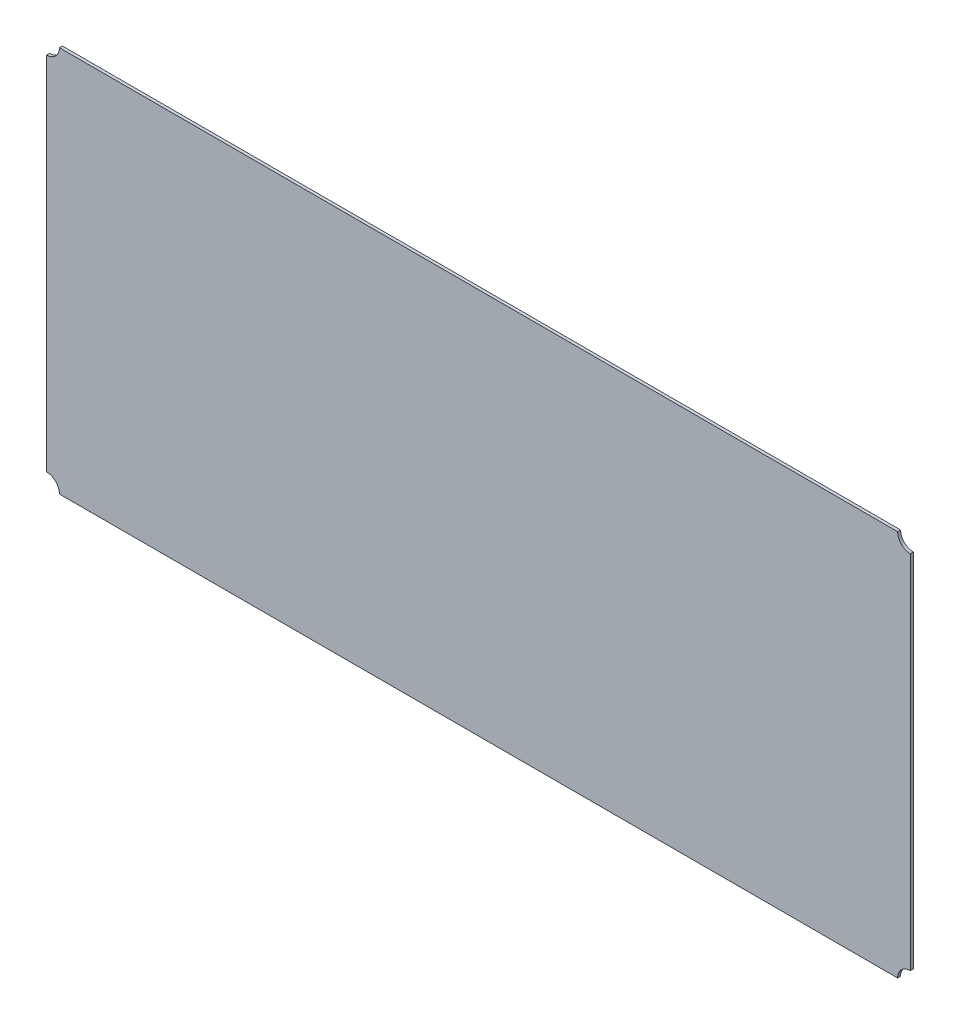
ISO-10303-21;
HEADER;
FILE_DESCRIPTION(('STEP AP214'),'2;1');
FILE_NAME('part.step','',(''),(''),'','','');
FILE_SCHEMA(('AUTOMOTIVE_DESIGN { 1 0 10303 214 1 1 1 1 }'));
ENDSEC;
DATA;
#1=APPLICATION_CONTEXT('core data for automotive mechanical design processes');
#2=APPLICATION_PROTOCOL_DEFINITION('international standard','automotive_design',2000,#1);
#3=PRODUCT_CONTEXT('',#1,'mechanical');
#4=PRODUCT('Part','Part','',(#3));
#5=PRODUCT_RELATED_PRODUCT_CATEGORY('part','',(#4));
#6=PRODUCT_DEFINITION_FORMATION('','',#4);
#7=PRODUCT_DEFINITION_CONTEXT('part definition',#1,'design');
#8=PRODUCT_DEFINITION('design','',#6,#7);
#9=PRODUCT_DEFINITION_SHAPE('','',#8);
#10=(LENGTH_UNIT() NAMED_UNIT(*) SI_UNIT(.MILLI.,.METRE.));
#11=(NAMED_UNIT(*) PLANE_ANGLE_UNIT() SI_UNIT($,.RADIAN.));
#12=(NAMED_UNIT(*) SI_UNIT($,.STERADIAN.) SOLID_ANGLE_UNIT());
#13=UNCERTAINTY_MEASURE_WITH_UNIT(LENGTH_MEASURE(1.E-05),#10,'distance_accuracy_value','');
#14=(GEOMETRIC_REPRESENTATION_CONTEXT(3) GLOBAL_UNCERTAINTY_ASSIGNED_CONTEXT((#13)) GLOBAL_UNIT_ASSIGNED_CONTEXT((#10,
#11,#12)) REPRESENTATION_CONTEXT('',''));
#15=CARTESIAN_POINT('',(0.,0.,0.));
#16=DIRECTION('',(0.,0.,1.));
#17=DIRECTION('',(1.,0.,0.));
#18=AXIS2_PLACEMENT_3D('',#15,#16,#17);
#19=CARTESIAN_POINT('',(-441.25,-197.5,-3.));
#20=DIRECTION('',(-1.,0.,0.));
#21=DIRECTION('',(0.,0.,1.));
#22=AXIS2_PLACEMENT_3D('',#19,#20,#21);
#23=PLANE('',#22);
#24=DIRECTION('',(0.,0.,1.));
#25=VECTOR('',#24,1.);
#26=CARTESIAN_POINT('',(-441.25,-184.5,-3.));
#27=LINE('',#26,#25);
#28=CARTESIAN_POINT('',(-441.25,-184.5,0.));
#29=VERTEX_POINT('',#28);
#30=CARTESIAN_POINT('',(-441.25,-184.5,-3.));
#31=VERTEX_POINT('',#30);
#32=EDGE_CURVE('E131',#29,#31,#27,.F.);
#33=ORIENTED_EDGE('',*,*,#32,.F.);
#34=DIRECTION('',(0.,-1.,0.));
#35=VECTOR('',#34,1.);
#36=CARTESIAN_POINT('',(-441.25,-197.5,0.));
#37=LINE('',#36,#35);
#38=CARTESIAN_POINT('',(-441.25,184.5,0.));
#39=VERTEX_POINT('',#38);
#40=EDGE_CURVE('E127',#39,#29,#37,.T.);
#41=ORIENTED_EDGE('',*,*,#40,.F.);
#42=DIRECTION('',(0.,0.,1.));
#43=VECTOR('',#42,1.);
#44=CARTESIAN_POINT('',(-441.25,184.5,-3.));
#45=LINE('',#44,#43);
#46=CARTESIAN_POINT('',(-441.25,184.5,-3.));
#47=VERTEX_POINT('',#46);
#48=EDGE_CURVE('E147',#47,#39,#45,.T.);
#49=ORIENTED_EDGE('',*,*,#48,.F.);
#50=DIRECTION('',(0.,-1.,0.));
#51=VECTOR('',#50,1.);
#52=CARTESIAN_POINT('',(-441.25,-197.5,-3.));
#53=LINE('',#52,#51);
#54=EDGE_CURVE('E123',#47,#31,#53,.T.);
#55=ORIENTED_EDGE('',*,*,#54,.T.);
#56=EDGE_LOOP('',(#33,#41,#49,#55));
#57=FACE_BOUND('',#56,.T.);
#58=ADVANCED_FACE('F33',(#57),#23,.T.);
#59=CARTESIAN_POINT('',(441.25,197.5,-3.));
#60=DIRECTION('',(0.,1.,0.));
#61=DIRECTION('',(0.,0.,1.));
#62=AXIS2_PLACEMENT_3D('',#59,#60,#61);
#63=PLANE('',#62);
#64=DIRECTION('',(0.,0.,1.));
#65=VECTOR('',#64,1.);
#66=CARTESIAN_POINT('',(-428.25,197.5,-3.));
#67=LINE('',#66,#65);
#68=CARTESIAN_POINT('',(-428.25,197.5,0.));
#69=VERTEX_POINT('',#68);
#70=CARTESIAN_POINT('',(-428.25,197.5,-3.));
#71=VERTEX_POINT('',#70);
#72=EDGE_CURVE('E144',#69,#71,#67,.F.);
#73=ORIENTED_EDGE('',*,*,#72,.F.);
#74=DIRECTION('',(-1.,0.,0.));
#75=VECTOR('',#74,1.);
#76=CARTESIAN_POINT('',(441.25,197.5,0.));
#77=LINE('',#76,#75);
#78=CARTESIAN_POINT('',(428.25,197.5,0.));
#79=VERTEX_POINT('',#78);
#80=EDGE_CURVE('E135',#79,#69,#77,.T.);
#81=ORIENTED_EDGE('',*,*,#80,.F.);
#82=DIRECTION('',(0.,0.,1.));
#83=VECTOR('',#82,1.);
#84=CARTESIAN_POINT('',(428.25,197.5,-3.));
#85=LINE('',#84,#83);
#86=CARTESIAN_POINT('',(428.25,197.5,-3.));
#87=VERTEX_POINT('',#86);
#88=EDGE_CURVE('E47',#87,#79,#85,.T.);
#89=ORIENTED_EDGE('',*,*,#88,.F.);
#90=DIRECTION('',(-1.,0.,0.));
#91=VECTOR('',#90,1.);
#92=CARTESIAN_POINT('',(441.25,197.5,-3.));
#93=LINE('',#92,#91);
#94=EDGE_CURVE('E117',#87,#71,#93,.T.);
#95=ORIENTED_EDGE('',*,*,#94,.T.);
#96=EDGE_LOOP('',(#73,#81,#89,#95));
#97=FACE_BOUND('',#96,.T.);
#98=ADVANCED_FACE('F152',(#97),#63,.T.);
#99=CARTESIAN_POINT('',(441.25,-197.5,-3.));
#100=DIRECTION('',(1.,0.,0.));
#101=DIRECTION('',(0.,0.,-1.));
#102=AXIS2_PLACEMENT_3D('',#99,#100,#101);
#103=PLANE('',#102);
#104=DIRECTION('',(0.,0.,1.));
#105=VECTOR('',#104,1.);
#106=CARTESIAN_POINT('',(441.25,184.5,-3.));
#107=LINE('',#106,#105);
#108=CARTESIAN_POINT('',(441.25,184.5,0.));
#109=VERTEX_POINT('',#108);
#110=CARTESIAN_POINT('',(441.25,184.5,-3.));
#111=VERTEX_POINT('',#110);
#112=EDGE_CURVE('E112',#109,#111,#107,.F.);
#113=ORIENTED_EDGE('',*,*,#112,.F.);
#114=DIRECTION('',(0.,1.,0.));
#115=VECTOR('',#114,1.);
#116=CARTESIAN_POINT('',(441.25,-197.5,0.));
#117=LINE('',#116,#115);
#118=CARTESIAN_POINT('',(441.25,-184.5,0.));
#119=VERTEX_POINT('',#118);
#120=EDGE_CURVE('E111',#119,#109,#117,.T.);
#121=ORIENTED_EDGE('',*,*,#120,.F.);
#122=DIRECTION('',(0.,0.,1.));
#123=VECTOR('',#122,1.);
#124=CARTESIAN_POINT('',(441.25,-184.5,-3.));
#125=LINE('',#124,#123);
#126=CARTESIAN_POINT('',(441.25,-184.5,-3.));
#127=VERTEX_POINT('',#126);
#128=EDGE_CURVE('E55',#127,#119,#125,.T.);
#129=ORIENTED_EDGE('',*,*,#128,.F.);
#130=DIRECTION('',(0.,1.,0.));
#131=VECTOR('',#130,1.);
#132=CARTESIAN_POINT('',(441.25,-197.5,-3.));
#133=LINE('',#132,#131);
#134=EDGE_CURVE('E109',#127,#111,#133,.T.);
#135=ORIENTED_EDGE('',*,*,#134,.T.);
#136=EDGE_LOOP('',(#113,#121,#129,#135));
#137=FACE_BOUND('',#136,.T.);
#138=ADVANCED_FACE('F108',(#137),#103,.T.);
#139=CARTESIAN_POINT('',(441.25,-197.5,-3.));
#140=DIRECTION('',(0.,-1.,0.));
#141=DIRECTION('',(0.,0.,-1.));
#142=AXIS2_PLACEMENT_3D('',#139,#140,#141);
#143=PLANE('',#142);
#144=DIRECTION('',(0.,0.,1.));
#145=VECTOR('',#144,1.);
#146=CARTESIAN_POINT('',(-428.25,-197.5,-3.));
#147=LINE('',#146,#145);
#148=CARTESIAN_POINT('',(-428.25,-197.5,-3.));
#149=VERTEX_POINT('',#148);
#150=CARTESIAN_POINT('',(-428.25,-197.5,0.));
#151=VERTEX_POINT('',#150);
#152=EDGE_CURVE('E162',#149,#151,#147,.T.);
#153=ORIENTED_EDGE('',*,*,#152,.F.);
#154=DIRECTION('',(1.,0.,0.));
#155=VECTOR('',#154,1.);
#156=CARTESIAN_POINT('',(441.25,-197.5,-3.));
#157=LINE('',#156,#155);
#158=CARTESIAN_POINT('',(428.25,-197.5,-3.));
#159=VERTEX_POINT('',#158);
#160=EDGE_CURVE('E118',#149,#159,#157,.T.);
#161=ORIENTED_EDGE('',*,*,#160,.T.);
#162=DIRECTION('',(0.,0.,1.));
#163=VECTOR('',#162,1.);
#164=CARTESIAN_POINT('',(428.25,-197.5,-3.));
#165=LINE('',#164,#163);
#166=CARTESIAN_POINT('',(428.25,-197.5,0.));
#167=VERTEX_POINT('',#166);
#168=EDGE_CURVE('E97',#167,#159,#165,.F.);
#169=ORIENTED_EDGE('',*,*,#168,.F.);
#170=DIRECTION('',(1.,0.,0.));
#171=VECTOR('',#170,1.);
#172=CARTESIAN_POINT('',(441.25,-197.5,0.));
#173=LINE('',#172,#171);
#174=EDGE_CURVE('E130',#151,#167,#173,.T.);
#175=ORIENTED_EDGE('',*,*,#174,.F.);
#176=EDGE_LOOP('',(#153,#161,#169,#175));
#177=FACE_BOUND('',#176,.T.);
#178=ADVANCED_FACE('F179',(#177),#143,.T.);
#179=CARTESIAN_POINT('',(0.,0.,-3.));
#180=DIRECTION('',(0.,0.,1.));
#181=DIRECTION('',(1.,0.,0.));
#182=AXIS2_PLACEMENT_3D('',#179,#180,#181);
#183=PLANE('',#182);
#184=ORIENTED_EDGE('',*,*,#160,.F.);
#185=CARTESIAN_POINT('',(-441.25,-197.5,-3.));
#186=DIRECTION('',(0.,0.,1.));
#187=DIRECTION('',(1.,0.,0.));
#188=AXIS2_PLACEMENT_3D('',#185,#186,#187);
#189=CIRCLE('',#188,13.);
#190=EDGE_CURVE('E170',#149,#31,#189,.T.);
#191=ORIENTED_EDGE('',*,*,#190,.T.);
#192=ORIENTED_EDGE('',*,*,#54,.F.);
#193=CARTESIAN_POINT('',(-441.25,197.5,-3.));
#194=DIRECTION('',(0.,0.,1.));
#195=DIRECTION('',(1.,0.,0.));
#196=AXIS2_PLACEMENT_3D('',#193,#194,#195);
#197=CIRCLE('',#196,13.);
#198=EDGE_CURVE('E169',#47,#71,#197,.T.);
#199=ORIENTED_EDGE('',*,*,#198,.T.);
#200=ORIENTED_EDGE('',*,*,#94,.F.);
#201=CARTESIAN_POINT('',(441.25,197.5,-3.));
#202=DIRECTION('',(0.,0.,1.));
#203=DIRECTION('',(1.,0.,0.));
#204=AXIS2_PLACEMENT_3D('',#201,#202,#203);
#205=CIRCLE('',#204,13.);
#206=EDGE_CURVE('E102',#87,#111,#205,.T.);
#207=ORIENTED_EDGE('',*,*,#206,.T.);
#208=ORIENTED_EDGE('',*,*,#134,.F.);
#209=CARTESIAN_POINT('',(441.25,-197.5,-3.));
#210=DIRECTION('',(0.,0.,1.));
#211=DIRECTION('',(1.,0.,0.));
#212=AXIS2_PLACEMENT_3D('',#209,#210,#211);
#213=CIRCLE('',#212,13.);
#214=EDGE_CURVE('E94',#127,#159,#213,.T.);
#215=ORIENTED_EDGE('',*,*,#214,.T.);
#216=EDGE_LOOP('',(#184,#191,#192,#199,#200,#207,#208,#215));
#217=FACE_BOUND('',#216,.T.);
#218=ADVANCED_FACE('F115',(#217),#183,.F.);
#219=CARTESIAN_POINT('',(0.,0.,0.));
#220=DIRECTION('',(0.,0.,1.));
#221=DIRECTION('',(1.,0.,0.));
#222=AXIS2_PLACEMENT_3D('',#219,#220,#221);
#223=PLANE('',#222);
#224=CARTESIAN_POINT('',(-441.25,-197.5,0.));
#225=DIRECTION('',(0.,0.,1.));
#226=DIRECTION('',(1.,0.,0.));
#227=AXIS2_PLACEMENT_3D('',#224,#225,#226);
#228=CIRCLE('',#227,13.);
#229=EDGE_CURVE('E11',#151,#29,#228,.T.);
#230=ORIENTED_EDGE('',*,*,#229,.F.);
#231=ORIENTED_EDGE('',*,*,#174,.T.);
#232=CARTESIAN_POINT('',(441.25,-197.5,0.));
#233=DIRECTION('',(0.,0.,1.));
#234=DIRECTION('',(1.,0.,0.));
#235=AXIS2_PLACEMENT_3D('',#232,#233,#234);
#236=CIRCLE('',#235,13.);
#237=EDGE_CURVE('E121',#119,#167,#236,.T.);
#238=ORIENTED_EDGE('',*,*,#237,.F.);
#239=ORIENTED_EDGE('',*,*,#120,.T.);
#240=CARTESIAN_POINT('',(441.25,197.5,0.));
#241=DIRECTION('',(0.,0.,1.));
#242=DIRECTION('',(1.,0.,0.));
#243=AXIS2_PLACEMENT_3D('',#240,#241,#242);
#244=CIRCLE('',#243,13.);
#245=EDGE_CURVE('E139',#79,#109,#244,.T.);
#246=ORIENTED_EDGE('',*,*,#245,.F.);
#247=ORIENTED_EDGE('',*,*,#80,.T.);
#248=CARTESIAN_POINT('',(-441.25,197.5,0.));
#249=DIRECTION('',(0.,0.,1.));
#250=DIRECTION('',(1.,0.,0.));
#251=AXIS2_PLACEMENT_3D('',#248,#249,#250);
#252=CIRCLE('',#251,13.);
#253=EDGE_CURVE('E40',#39,#69,#252,.T.);
#254=ORIENTED_EDGE('',*,*,#253,.F.);
#255=ORIENTED_EDGE('',*,*,#40,.T.);
#256=EDGE_LOOP('',(#230,#231,#238,#239,#246,#247,#254,#255));
#257=FACE_BOUND('',#256,.T.);
#258=ADVANCED_FACE('F155',(#257),#223,.T.);
#259=CARTESIAN_POINT('',(441.25,-197.5,-3.));
#260=DIRECTION('',(0.,0.,1.));
#261=DIRECTION('',(1.,0.,0.));
#262=AXIS2_PLACEMENT_3D('',#259,#260,#261);
#263=CYLINDRICAL_SURFACE('',#262,13.);
#264=ORIENTED_EDGE('',*,*,#128,.T.);
#265=ORIENTED_EDGE('',*,*,#237,.T.);
#266=ORIENTED_EDGE('',*,*,#168,.T.);
#267=ORIENTED_EDGE('',*,*,#214,.F.);
#268=EDGE_LOOP('',(#264,#265,#266,#267));
#269=FACE_BOUND('',#268,.T.);
#270=ADVANCED_FACE('F95',(#269),#263,.F.);
#271=CARTESIAN_POINT('',(441.25,197.5,-3.));
#272=DIRECTION('',(0.,0.,1.));
#273=DIRECTION('',(1.,0.,0.));
#274=AXIS2_PLACEMENT_3D('',#271,#272,#273);
#275=CYLINDRICAL_SURFACE('',#274,13.);
#276=ORIENTED_EDGE('',*,*,#88,.T.);
#277=ORIENTED_EDGE('',*,*,#245,.T.);
#278=ORIENTED_EDGE('',*,*,#112,.T.);
#279=ORIENTED_EDGE('',*,*,#206,.F.);
#280=EDGE_LOOP('',(#276,#277,#278,#279));
#281=FACE_BOUND('',#280,.T.);
#282=ADVANCED_FACE('F156',(#281),#275,.F.);
#283=CARTESIAN_POINT('',(-441.25,197.5,-3.));
#284=DIRECTION('',(0.,0.,1.));
#285=DIRECTION('',(1.,0.,0.));
#286=AXIS2_PLACEMENT_3D('',#283,#284,#285);
#287=CYLINDRICAL_SURFACE('',#286,13.);
#288=ORIENTED_EDGE('',*,*,#48,.T.);
#289=ORIENTED_EDGE('',*,*,#253,.T.);
#290=ORIENTED_EDGE('',*,*,#72,.T.);
#291=ORIENTED_EDGE('',*,*,#198,.F.);
#292=EDGE_LOOP('',(#288,#289,#290,#291));
#293=FACE_BOUND('',#292,.T.);
#294=ADVANCED_FACE('F143',(#293),#287,.F.);
#295=CARTESIAN_POINT('',(-441.25,-197.5,-3.));
#296=DIRECTION('',(0.,0.,1.));
#297=DIRECTION('',(1.,0.,0.));
#298=AXIS2_PLACEMENT_3D('',#295,#296,#297);
#299=CYLINDRICAL_SURFACE('',#298,13.);
#300=ORIENTED_EDGE('',*,*,#32,.T.);
#301=ORIENTED_EDGE('',*,*,#190,.F.);
#302=ORIENTED_EDGE('',*,*,#152,.T.);
#303=ORIENTED_EDGE('',*,*,#229,.T.);
#304=EDGE_LOOP('',(#300,#301,#302,#303));
#305=FACE_BOUND('',#304,.T.);
#306=ADVANCED_FACE('F176',(#305),#299,.F.);
#307=CLOSED_SHELL('',(#58,#98,#138,#178,#218,#258,#270,#282,#294,#306));
#308=MANIFOLD_SOLID_BREP('B2',#307);
#309=ADVANCED_BREP_SHAPE_REPRESENTATION('',(#18,#308),#14);
#310=SHAPE_DEFINITION_REPRESENTATION(#9,#309);
ENDSEC;
END-ISO-10303-21;
